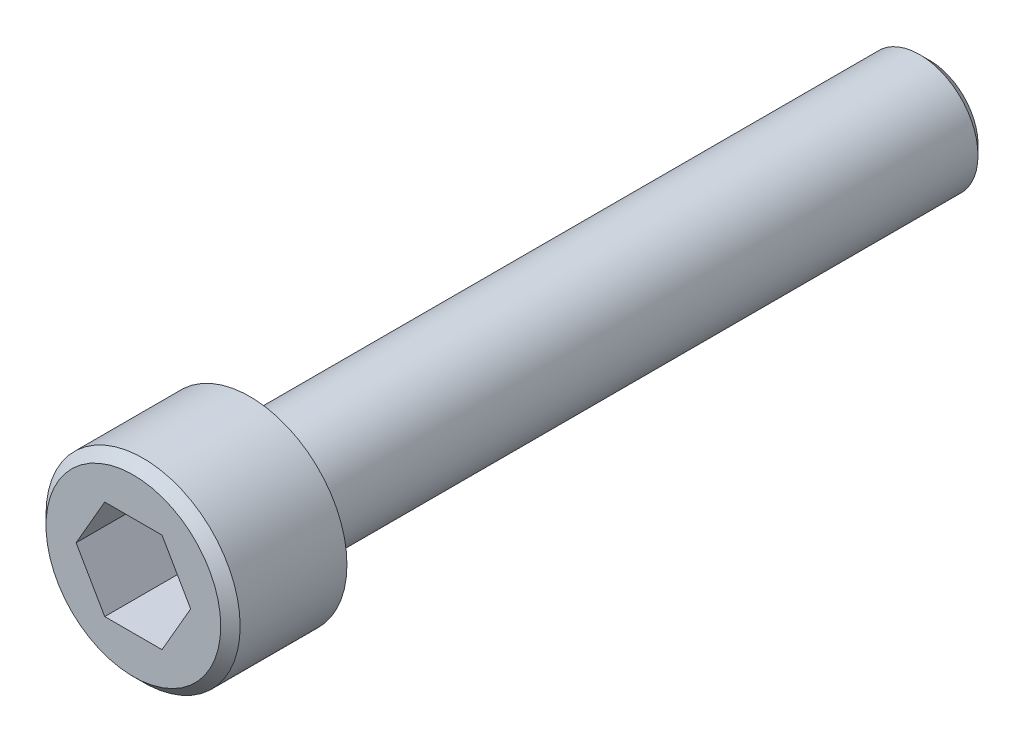
ISO-10303-21;
HEADER;
FILE_DESCRIPTION(('STEP AP214'),'2;1');
FILE_NAME('part.step','',(''),(''),'','','');
FILE_SCHEMA(('AUTOMOTIVE_DESIGN { 1 0 10303 214 1 1 1 1 }'));
ENDSEC;
DATA;
#1=APPLICATION_CONTEXT('core data for automotive mechanical design processes');
#2=APPLICATION_PROTOCOL_DEFINITION('international standard','automotive_design',2000,#1);
#3=PRODUCT_CONTEXT('',#1,'mechanical');
#4=PRODUCT('Part','Part','',(#3));
#5=PRODUCT_RELATED_PRODUCT_CATEGORY('part','',(#4));
#6=PRODUCT_DEFINITION_FORMATION('','',#4);
#7=PRODUCT_DEFINITION_CONTEXT('part definition',#1,'design');
#8=PRODUCT_DEFINITION('design','',#6,#7);
#9=PRODUCT_DEFINITION_SHAPE('','',#8);
#10=(LENGTH_UNIT() NAMED_UNIT(*) SI_UNIT(.MILLI.,.METRE.));
#11=(NAMED_UNIT(*) PLANE_ANGLE_UNIT() SI_UNIT($,.RADIAN.));
#12=(NAMED_UNIT(*) SI_UNIT($,.STERADIAN.) SOLID_ANGLE_UNIT());
#13=UNCERTAINTY_MEASURE_WITH_UNIT(LENGTH_MEASURE(1.E-05),#10,'distance_accuracy_value','');
#14=(GEOMETRIC_REPRESENTATION_CONTEXT(3) GLOBAL_UNCERTAINTY_ASSIGNED_CONTEXT((#13)) GLOBAL_UNIT_ASSIGNED_CONTEXT((#10,
#11,#12)) REPRESENTATION_CONTEXT('',''));
#15=CARTESIAN_POINT('',(0.,0.,0.));
#16=DIRECTION('',(0.,0.,1.));
#17=DIRECTION('',(1.,0.,0.));
#18=AXIS2_PLACEMENT_3D('',#15,#16,#17);
#19=CARTESIAN_POINT('',(0.,0.,0.));
#20=DIRECTION('',(0.,0.,1.));
#21=DIRECTION('',(1.,0.,0.));
#22=AXIS2_PLACEMENT_3D('',#19,#20,#21);
#23=PLANE('',#22);
#24=CARTESIAN_POINT('',(0.,0.,0.));
#25=DIRECTION('',(0.,0.,1.));
#26=DIRECTION('',(1.,0.,0.));
#27=AXIS2_PLACEMENT_3D('',#24,#25,#26);
#28=CIRCLE('',#27,5.);
#29=CARTESIAN_POINT('',(5.,0.,0.));
#30=VERTEX_POINT('',#29);
#31=EDGE_CURVE('E135',#30,#30,#28,.T.);
#32=ORIENTED_EDGE('',*,*,#31,.F.);
#33=EDGE_LOOP('',(#32));
#34=FACE_BOUND('',#33,.T.);
#35=CARTESIAN_POINT('',(0.,0.,0.));
#36=DIRECTION('',(0.,0.,1.));
#37=DIRECTION('',(1.,0.,0.));
#38=AXIS2_PLACEMENT_3D('',#35,#36,#37);
#39=CIRCLE('',#38,3.);
#40=CARTESIAN_POINT('',(3.,0.,0.));
#41=VERTEX_POINT('',#40);
#42=EDGE_CURVE('E143',#41,#41,#39,.F.);
#43=ORIENTED_EDGE('',*,*,#42,.F.);
#44=EDGE_LOOP('',(#43));
#45=FACE_BOUND('',#44,.T.);
#46=ADVANCED_FACE('F33',(#34,#45),#23,.F.);
#47=CARTESIAN_POINT('',(0.,0.,6.));
#48=DIRECTION('',(0.,0.,-1.));
#49=DIRECTION('',(-1.,0.,0.));
#50=AXIS2_PLACEMENT_3D('',#47,#48,#49);
#51=CYLINDRICAL_SURFACE('',#50,5.);
#52=CARTESIAN_POINT('',(0.,0.,5.5));
#53=DIRECTION('',(0.,0.,1.));
#54=DIRECTION('',(1.,0.,0.));
#55=AXIS2_PLACEMENT_3D('',#52,#53,#54);
#56=CIRCLE('',#55,5.);
#57=CARTESIAN_POINT('',(5.,0.,5.5));
#58=VERTEX_POINT('',#57);
#59=EDGE_CURVE('E149',#58,#58,#56,.F.);
#60=ORIENTED_EDGE('',*,*,#59,.T.);
#61=EDGE_LOOP('',(#60));
#62=FACE_BOUND('',#61,.T.);
#63=ORIENTED_EDGE('',*,*,#31,.T.);
#64=EDGE_LOOP('',(#63));
#65=FACE_BOUND('',#64,.T.);
#66=ADVANCED_FACE('F169',(#62,#65),#51,.T.);
#67=CARTESIAN_POINT('',(0.,0.,6.));
#68=DIRECTION('',(0.,0.,1.));
#69=DIRECTION('',(1.,0.,0.));
#70=AXIS2_PLACEMENT_3D('',#67,#68,#69);
#71=PLANE('',#70);
#72=DIRECTION('',(0.5,0.866025403784439,0.));
#73=VECTOR('',#72,1.);
#74=CARTESIAN_POINT('',(1.475,-2.5547749411641,6.));
#75=LINE('',#74,#73);
#76=CARTESIAN_POINT('',(1.475,-2.5547749411641,6.));
#77=VERTEX_POINT('',#76);
#78=CARTESIAN_POINT('',(2.95,0.,6.));
#79=VERTEX_POINT('',#78);
#80=EDGE_CURVE('E48',#77,#79,#75,.T.);
#81=ORIENTED_EDGE('',*,*,#80,.F.);
#82=DIRECTION('',(1.,0.,0.));
#83=VECTOR('',#82,1.);
#84=CARTESIAN_POINT('',(-1.475,-2.5547749411641,6.));
#85=LINE('',#84,#83);
#86=CARTESIAN_POINT('',(-1.475,-2.5547749411641,6.));
#87=VERTEX_POINT('',#86);
#88=EDGE_CURVE('E131',#87,#77,#85,.T.);
#89=ORIENTED_EDGE('',*,*,#88,.F.);
#90=DIRECTION('',(0.5,-0.866025403784438,0.));
#91=VECTOR('',#90,1.);
#92=CARTESIAN_POINT('',(-2.95,0.,6.));
#93=LINE('',#92,#91);
#94=CARTESIAN_POINT('',(-2.95,0.,6.));
#95=VERTEX_POINT('',#94);
#96=EDGE_CURVE('E129',#95,#87,#93,.T.);
#97=ORIENTED_EDGE('',*,*,#96,.F.);
#98=DIRECTION('',(-0.5,-0.866025403784439,0.));
#99=VECTOR('',#98,1.);
#100=CARTESIAN_POINT('',(-1.475,2.5547749411641,6.));
#101=LINE('',#100,#99);
#102=CARTESIAN_POINT('',(-1.475,2.5547749411641,6.));
#103=VERTEX_POINT('',#102);
#104=EDGE_CURVE('E96',#103,#95,#101,.T.);
#105=ORIENTED_EDGE('',*,*,#104,.F.);
#106=DIRECTION('',(-1.,0.,0.));
#107=VECTOR('',#106,1.);
#108=CARTESIAN_POINT('',(1.475,2.5547749411641,6.));
#109=LINE('',#108,#107);
#110=CARTESIAN_POINT('',(1.475,2.5547749411641,6.));
#111=VERTEX_POINT('',#110);
#112=EDGE_CURVE('E125',#111,#103,#109,.T.);
#113=ORIENTED_EDGE('',*,*,#112,.F.);
#114=DIRECTION('',(-0.5,0.866025403784439,0.));
#115=VECTOR('',#114,1.);
#116=CARTESIAN_POINT('',(2.95,0.,6.));
#117=LINE('',#116,#115);
#118=EDGE_CURVE('E122',#79,#111,#117,.T.);
#119=ORIENTED_EDGE('',*,*,#118,.F.);
#120=EDGE_LOOP('',(#81,#89,#97,#105,#113,#119));
#121=FACE_BOUND('',#120,.T.);
#122=CARTESIAN_POINT('',(0.,0.,6.));
#123=DIRECTION('',(0.,0.,1.));
#124=DIRECTION('',(1.,0.,0.));
#125=AXIS2_PLACEMENT_3D('',#122,#123,#124);
#126=CIRCLE('',#125,4.5);
#127=CARTESIAN_POINT('',(4.5,0.,6.));
#128=VERTEX_POINT('',#127);
#129=EDGE_CURVE('E146',#128,#128,#126,.T.);
#130=ORIENTED_EDGE('',*,*,#129,.T.);
#131=EDGE_LOOP('',(#130));
#132=FACE_BOUND('',#131,.T.);
#133=ADVANCED_FACE('F175',(#121,#132),#71,.T.);
#134=CARTESIAN_POINT('',(0.,0.,-35.));
#135=DIRECTION('',(0.,0.,1.));
#136=DIRECTION('',(1.,0.,0.));
#137=AXIS2_PLACEMENT_3D('',#134,#135,#136);
#138=CYLINDRICAL_SURFACE('',#137,3.);
#139=CARTESIAN_POINT('',(0.,0.,-34.5));
#140=DIRECTION('',(0.,0.,-1.));
#141=DIRECTION('',(-1.,0.,0.));
#142=AXIS2_PLACEMENT_3D('',#139,#140,#141);
#143=CIRCLE('',#142,3.);
#144=CARTESIAN_POINT('',(-3.,0.,-34.5));
#145=VERTEX_POINT('',#144);
#146=EDGE_CURVE('E11',#145,#145,#143,.F.);
#147=ORIENTED_EDGE('',*,*,#146,.T.);
#148=EDGE_LOOP('',(#147));
#149=FACE_BOUND('',#148,.T.);
#150=ORIENTED_EDGE('',*,*,#42,.T.);
#151=EDGE_LOOP('',(#150));
#152=FACE_BOUND('',#151,.T.);
#153=ADVANCED_FACE('F183',(#149,#152),#138,.T.);
#154=CARTESIAN_POINT('',(0.,0.,-35.));
#155=DIRECTION('',(0.,0.,-1.));
#156=DIRECTION('',(-1.,0.,0.));
#157=AXIS2_PLACEMENT_3D('',#154,#155,#156);
#158=PLANE('',#157);
#159=CARTESIAN_POINT('',(0.,0.,-35.));
#160=DIRECTION('',(0.,0.,-1.));
#161=DIRECTION('',(-1.,0.,0.));
#162=AXIS2_PLACEMENT_3D('',#159,#160,#161);
#163=CIRCLE('',#162,2.5);
#164=CARTESIAN_POINT('',(-2.5,0.,-35.));
#165=VERTEX_POINT('',#164);
#166=EDGE_CURVE('E41',#165,#165,#163,.T.);
#167=ORIENTED_EDGE('',*,*,#166,.T.);
#168=EDGE_LOOP('',(#167));
#169=FACE_BOUND('',#168,.T.);
#170=ADVANCED_FACE('F154',(#169),#158,.T.);
#171=CARTESIAN_POINT('',(0.,0.,6.));
#172=DIRECTION('',(0.,0.,-1.));
#173=DIRECTION('',(-1.,0.,0.));
#174=AXIS2_PLACEMENT_3D('',#171,#172,#173);
#175=CONICAL_SURFACE('',#174,4.5,0.785398163397449);
#176=ORIENTED_EDGE('',*,*,#59,.F.);
#177=EDGE_LOOP('',(#176));
#178=FACE_BOUND('',#177,.T.);
#179=ORIENTED_EDGE('',*,*,#129,.F.);
#180=EDGE_LOOP('',(#179));
#181=FACE_BOUND('',#180,.T.);
#182=ADVANCED_FACE('F158',(#178,#181),#175,.T.);
#183=CARTESIAN_POINT('',(0.,0.,-35.));
#184=DIRECTION('',(0.,0.,1.));
#185=DIRECTION('',(1.,0.,0.));
#186=AXIS2_PLACEMENT_3D('',#183,#184,#185);
#187=CONICAL_SURFACE('',#186,2.5,0.785398163397443);
#188=ORIENTED_EDGE('',*,*,#146,.F.);
#189=EDGE_LOOP('',(#188));
#190=FACE_BOUND('',#189,.T.);
#191=ORIENTED_EDGE('',*,*,#166,.F.);
#192=EDGE_LOOP('',(#191));
#193=FACE_BOUND('',#192,.T.);
#194=ADVANCED_FACE('F35',(#190,#193),#187,.T.);
#195=CARTESIAN_POINT('',(1.475,-2.5547749411641,2.));
#196=DIRECTION('',(0.866025403784439,-0.5,0.));
#197=DIRECTION('',(0.5,0.866025403784439,0.));
#198=AXIS2_PLACEMENT_3D('',#195,#196,#197);
#199=PLANE('',#198);
#200=ORIENTED_EDGE('',*,*,#80,.T.);
#201=DIRECTION('',(0.,0.,1.));
#202=VECTOR('',#201,1.);
#203=CARTESIAN_POINT('',(2.95,0.,2.));
#204=LINE('',#203,#202);
#205=CARTESIAN_POINT('',(2.95,0.,2.));
#206=VERTEX_POINT('',#205);
#207=EDGE_CURVE('E78',#206,#79,#204,.T.);
#208=ORIENTED_EDGE('',*,*,#207,.F.);
#209=DIRECTION('',(0.5,0.866025403784439,0.));
#210=VECTOR('',#209,1.);
#211=CARTESIAN_POINT('',(1.475,-2.5547749411641,2.));
#212=LINE('',#211,#210);
#213=CARTESIAN_POINT('',(1.475,-2.5547749411641,2.));
#214=VERTEX_POINT('',#213);
#215=EDGE_CURVE('E133',#214,#206,#212,.T.);
#216=ORIENTED_EDGE('',*,*,#215,.F.);
#217=DIRECTION('',(0.,0.,1.));
#218=VECTOR('',#217,1.);
#219=CARTESIAN_POINT('',(1.475,-2.5547749411641,2.));
#220=LINE('',#219,#218);
#221=EDGE_CURVE('E56',#214,#77,#220,.T.);
#222=ORIENTED_EDGE('',*,*,#221,.T.);
#223=EDGE_LOOP('',(#200,#208,#216,#222));
#224=FACE_BOUND('',#223,.T.);
#225=ADVANCED_FACE('F157',(#224),#199,.F.);
#226=CARTESIAN_POINT('',(-1.475,-2.5547749411641,2.));
#227=DIRECTION('',(0.,-1.,0.));
#228=DIRECTION('',(1.,0.,0.));
#229=AXIS2_PLACEMENT_3D('',#226,#227,#228);
#230=PLANE('',#229);
#231=ORIENTED_EDGE('',*,*,#88,.T.);
#232=ORIENTED_EDGE('',*,*,#221,.F.);
#233=DIRECTION('',(1.,0.,0.));
#234=VECTOR('',#233,1.);
#235=CARTESIAN_POINT('',(-1.475,-2.5547749411641,2.));
#236=LINE('',#235,#234);
#237=CARTESIAN_POINT('',(-1.475,-2.5547749411641,2.));
#238=VERTEX_POINT('',#237);
#239=EDGE_CURVE('E108',#238,#214,#236,.T.);
#240=ORIENTED_EDGE('',*,*,#239,.F.);
#241=DIRECTION('',(0.,0.,1.));
#242=VECTOR('',#241,1.);
#243=CARTESIAN_POINT('',(-1.475,-2.5547749411641,2.));
#244=LINE('',#243,#242);
#245=EDGE_CURVE('E100',#238,#87,#244,.T.);
#246=ORIENTED_EDGE('',*,*,#245,.T.);
#247=EDGE_LOOP('',(#231,#232,#240,#246));
#248=FACE_BOUND('',#247,.T.);
#249=ADVANCED_FACE('F164',(#248),#230,.F.);
#250=CARTESIAN_POINT('',(-2.95,0.,2.));
#251=DIRECTION('',(-0.866025403784439,-0.5,0.));
#252=DIRECTION('',(0.5,-0.866025403784438,0.));
#253=AXIS2_PLACEMENT_3D('',#250,#251,#252);
#254=PLANE('',#253);
#255=ORIENTED_EDGE('',*,*,#96,.T.);
#256=ORIENTED_EDGE('',*,*,#245,.F.);
#257=DIRECTION('',(0.5,-0.866025403784438,0.));
#258=VECTOR('',#257,1.);
#259=CARTESIAN_POINT('',(-2.95,0.,2.));
#260=LINE('',#259,#258);
#261=CARTESIAN_POINT('',(-2.95,0.,2.));
#262=VERTEX_POINT('',#261);
#263=EDGE_CURVE('E104',#262,#238,#260,.T.);
#264=ORIENTED_EDGE('',*,*,#263,.F.);
#265=DIRECTION('',(0.,0.,1.));
#266=VECTOR('',#265,1.);
#267=CARTESIAN_POINT('',(-2.95,0.,2.));
#268=LINE('',#267,#266);
#269=EDGE_CURVE('E89',#262,#95,#268,.T.);
#270=ORIENTED_EDGE('',*,*,#269,.T.);
#271=EDGE_LOOP('',(#255,#256,#264,#270));
#272=FACE_BOUND('',#271,.T.);
#273=ADVANCED_FACE('F105',(#272),#254,.F.);
#274=CARTESIAN_POINT('',(-1.475,2.5547749411641,2.));
#275=DIRECTION('',(-0.866025403784439,0.5,0.));
#276=DIRECTION('',(-0.5,-0.866025403784439,0.));
#277=AXIS2_PLACEMENT_3D('',#274,#275,#276);
#278=PLANE('',#277);
#279=ORIENTED_EDGE('',*,*,#104,.T.);
#280=ORIENTED_EDGE('',*,*,#269,.F.);
#281=DIRECTION('',(-0.5,-0.866025403784439,0.));
#282=VECTOR('',#281,1.);
#283=CARTESIAN_POINT('',(-1.475,2.5547749411641,2.));
#284=LINE('',#283,#282);
#285=CARTESIAN_POINT('',(-1.475,2.5547749411641,2.));
#286=VERTEX_POINT('',#285);
#287=EDGE_CURVE('E93',#286,#262,#284,.T.);
#288=ORIENTED_EDGE('',*,*,#287,.F.);
#289=DIRECTION('',(0.,0.,1.));
#290=VECTOR('',#289,1.);
#291=CARTESIAN_POINT('',(-1.475,2.5547749411641,2.));
#292=LINE('',#291,#290);
#293=EDGE_CURVE('E101',#286,#103,#292,.T.);
#294=ORIENTED_EDGE('',*,*,#293,.T.);
#295=EDGE_LOOP('',(#279,#280,#288,#294));
#296=FACE_BOUND('',#295,.T.);
#297=ADVANCED_FACE('F91',(#296),#278,.F.);
#298=CARTESIAN_POINT('',(1.475,2.5547749411641,2.));
#299=DIRECTION('',(0.,1.,0.));
#300=DIRECTION('',(0.,0.,1.));
#301=AXIS2_PLACEMENT_3D('',#298,#299,#300);
#302=PLANE('',#301);
#303=ORIENTED_EDGE('',*,*,#112,.T.);
#304=ORIENTED_EDGE('',*,*,#293,.F.);
#305=DIRECTION('',(-1.,0.,0.));
#306=VECTOR('',#305,1.);
#307=CARTESIAN_POINT('',(1.475,2.5547749411641,2.));
#308=LINE('',#307,#306);
#309=CARTESIAN_POINT('',(1.475,2.5547749411641,2.));
#310=VERTEX_POINT('',#309);
#311=EDGE_CURVE('E114',#310,#286,#308,.T.);
#312=ORIENTED_EDGE('',*,*,#311,.F.);
#313=DIRECTION('',(0.,0.,1.));
#314=VECTOR('',#313,1.);
#315=CARTESIAN_POINT('',(1.475,2.5547749411641,2.));
#316=LINE('',#315,#314);
#317=EDGE_CURVE('E138',#310,#111,#316,.T.);
#318=ORIENTED_EDGE('',*,*,#317,.T.);
#319=EDGE_LOOP('',(#303,#304,#312,#318));
#320=FACE_BOUND('',#319,.T.);
#321=ADVANCED_FACE('F193',(#320),#302,.F.);
#322=CARTESIAN_POINT('',(2.95,0.,2.));
#323=DIRECTION('',(0.866025403784439,0.5,0.));
#324=DIRECTION('',(-0.5,0.866025403784439,0.));
#325=AXIS2_PLACEMENT_3D('',#322,#323,#324);
#326=PLANE('',#325);
#327=ORIENTED_EDGE('',*,*,#118,.T.);
#328=ORIENTED_EDGE('',*,*,#317,.F.);
#329=DIRECTION('',(-0.5,0.866025403784439,0.));
#330=VECTOR('',#329,1.);
#331=CARTESIAN_POINT('',(2.95,0.,2.));
#332=LINE('',#331,#330);
#333=EDGE_CURVE('E116',#206,#310,#332,.T.);
#334=ORIENTED_EDGE('',*,*,#333,.F.);
#335=ORIENTED_EDGE('',*,*,#207,.T.);
#336=EDGE_LOOP('',(#327,#328,#334,#335));
#337=FACE_BOUND('',#336,.T.);
#338=ADVANCED_FACE('F190',(#337),#326,.F.);
#339=CARTESIAN_POINT('',(0.,0.,2.));
#340=DIRECTION('',(0.,0.,1.));
#341=DIRECTION('',(1.,0.,0.));
#342=AXIS2_PLACEMENT_3D('',#339,#340,#341);
#343=PLANE('',#342);
#344=ORIENTED_EDGE('',*,*,#215,.T.);
#345=ORIENTED_EDGE('',*,*,#333,.T.);
#346=ORIENTED_EDGE('',*,*,#311,.T.);
#347=ORIENTED_EDGE('',*,*,#287,.T.);
#348=ORIENTED_EDGE('',*,*,#263,.T.);
#349=ORIENTED_EDGE('',*,*,#239,.T.);
#350=EDGE_LOOP('',(#344,#345,#346,#347,#348,#349));
#351=FACE_BOUND('',#350,.T.);
#352=ADVANCED_FACE('F111',(#351),#343,.T.);
#353=CLOSED_SHELL('',(#46,#66,#133,#153,#170,#182,#194,#225,#249,#273,#297,#321,#338,#352));
#354=MANIFOLD_SOLID_BREP('B2',#353);
#355=ADVANCED_BREP_SHAPE_REPRESENTATION('',(#18,#354),#14);
#356=SHAPE_DEFINITION_REPRESENTATION(#9,#355);
ENDSEC;
END-ISO-10303-21;
